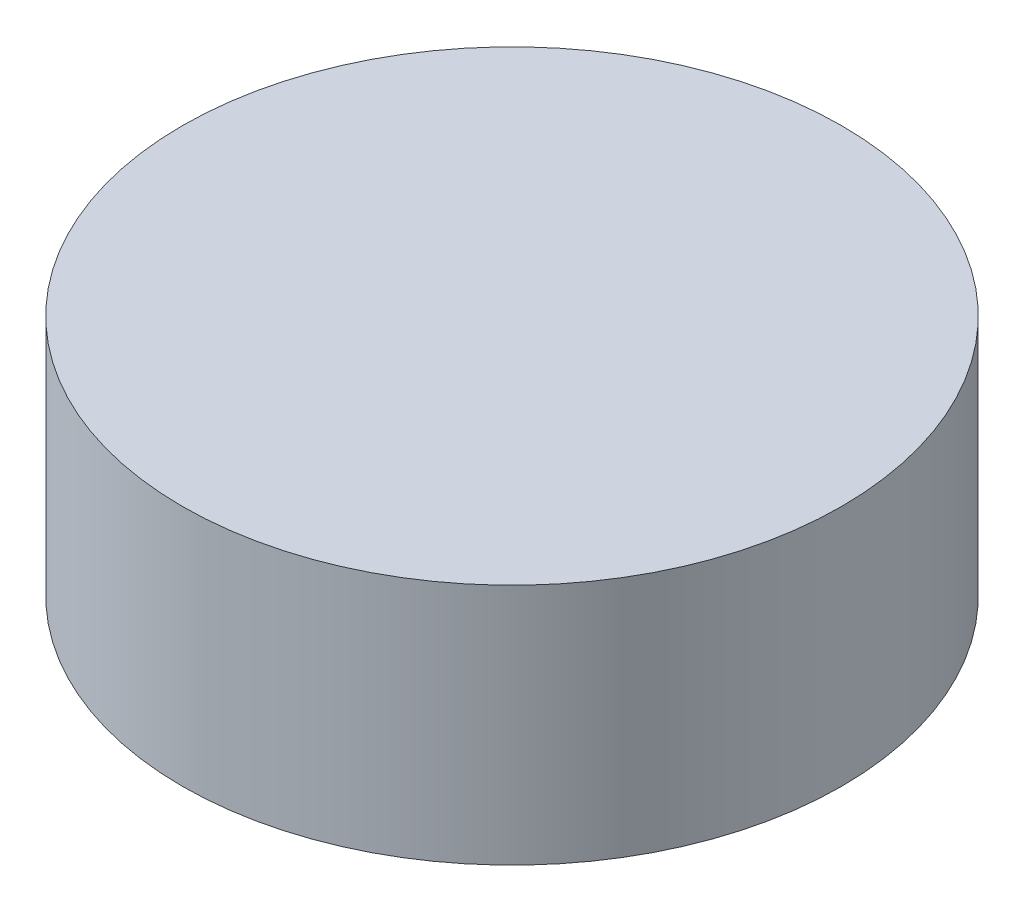
ISO-10303-21;
HEADER;
FILE_DESCRIPTION(('STEP AP214'),'2;1');
FILE_NAME('part.step','',(''),(''),'','','');
FILE_SCHEMA(('AUTOMOTIVE_DESIGN { 1 0 10303 214 1 1 1 1 }'));
ENDSEC;
DATA;
#1=APPLICATION_CONTEXT('core data for automotive mechanical design processes');
#2=APPLICATION_PROTOCOL_DEFINITION('international standard','automotive_design',2000,#1);
#3=PRODUCT_CONTEXT('',#1,'mechanical');
#4=PRODUCT('Part','Part','',(#3));
#5=PRODUCT_RELATED_PRODUCT_CATEGORY('part','',(#4));
#6=PRODUCT_DEFINITION_FORMATION('','',#4);
#7=PRODUCT_DEFINITION_CONTEXT('part definition',#1,'design');
#8=PRODUCT_DEFINITION('design','',#6,#7);
#9=PRODUCT_DEFINITION_SHAPE('','',#8);
#10=(LENGTH_UNIT() NAMED_UNIT(*) SI_UNIT(.MILLI.,.METRE.));
#11=(NAMED_UNIT(*) PLANE_ANGLE_UNIT() SI_UNIT($,.RADIAN.));
#12=(NAMED_UNIT(*) SI_UNIT($,.STERADIAN.) SOLID_ANGLE_UNIT());
#13=UNCERTAINTY_MEASURE_WITH_UNIT(LENGTH_MEASURE(1.E-05),#10,'distance_accuracy_value','');
#14=(GEOMETRIC_REPRESENTATION_CONTEXT(3) GLOBAL_UNCERTAINTY_ASSIGNED_CONTEXT((#13)) GLOBAL_UNIT_ASSIGNED_CONTEXT((#10,
#11,#12)) REPRESENTATION_CONTEXT('',''));
#15=CARTESIAN_POINT('',(0.,0.,0.));
#16=DIRECTION('',(0.,0.,1.));
#17=DIRECTION('',(1.,0.,0.));
#18=AXIS2_PLACEMENT_3D('',#15,#16,#17);
#19=CARTESIAN_POINT('',(0.,10.,0.));
#20=DIRECTION('',(0.,-1.,0.));
#21=DIRECTION('',(0.,0.,-1.));
#22=AXIS2_PLACEMENT_3D('',#19,#20,#21);
#23=CYLINDRICAL_SURFACE('',#22,13.6);
#24=CARTESIAN_POINT('',(0.,10.,0.));
#25=DIRECTION('',(0.,1.,0.));
#26=DIRECTION('',(0.,0.,1.));
#27=AXIS2_PLACEMENT_3D('',#24,#25,#26);
#28=CIRCLE('',#27,13.6);
#29=CARTESIAN_POINT('',(0.,10.,13.6));
#30=VERTEX_POINT('',#29);
#31=EDGE_CURVE('E10',#30,#30,#28,.T.);
#32=ORIENTED_EDGE('',*,*,#31,.F.);
#33=EDGE_LOOP('',(#32));
#34=FACE_BOUND('',#33,.T.);
#35=CARTESIAN_POINT('',(0.,0.,0.));
#36=DIRECTION('',(0.,1.,0.));
#37=DIRECTION('',(0.,0.,1.));
#38=AXIS2_PLACEMENT_3D('',#35,#36,#37);
#39=CIRCLE('',#38,13.6);
#40=CARTESIAN_POINT('',(0.,0.,13.6));
#41=VERTEX_POINT('',#40);
#42=EDGE_CURVE('E40',#41,#41,#39,.T.);
#43=ORIENTED_EDGE('',*,*,#42,.T.);
#44=EDGE_LOOP('',(#43));
#45=FACE_BOUND('',#44,.T.);
#46=ADVANCED_FACE('F37',(#34,#45),#23,.T.);
#47=CARTESIAN_POINT('',(0.,10.,0.));
#48=DIRECTION('',(0.,1.,0.));
#49=DIRECTION('',(0.,0.,1.));
#50=AXIS2_PLACEMENT_3D('',#47,#48,#49);
#51=PLANE('',#50);
#52=ORIENTED_EDGE('',*,*,#31,.T.);
#53=EDGE_LOOP('',(#52));
#54=FACE_BOUND('',#53,.T.);
#55=ADVANCED_FACE('F54',(#54),#51,.T.);
#56=CARTESIAN_POINT('',(0.,0.,0.));
#57=DIRECTION('',(0.,1.,0.));
#58=DIRECTION('',(0.,0.,1.));
#59=AXIS2_PLACEMENT_3D('',#56,#57,#58);
#60=PLANE('',#59);
#61=ORIENTED_EDGE('',*,*,#42,.F.);
#62=EDGE_LOOP('',(#61));
#63=FACE_BOUND('',#62,.T.);
#64=ADVANCED_FACE('F52',(#63),#60,.F.);
#65=CLOSED_SHELL('',(#46,#55,#64));
#66=MANIFOLD_SOLID_BREP('B2',#65);
#67=ADVANCED_BREP_SHAPE_REPRESENTATION('',(#18,#66),#14);
#68=SHAPE_DEFINITION_REPRESENTATION(#9,#67);
ENDSEC;
END-ISO-10303-21;
